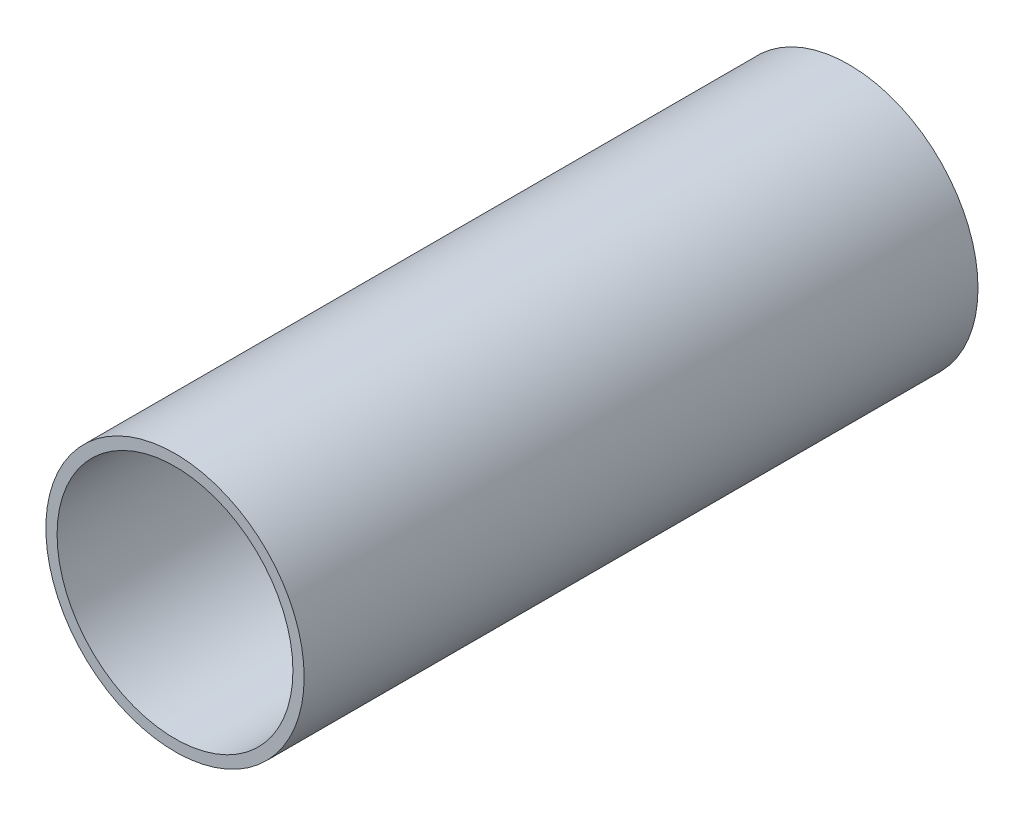
ISO-10303-21;
HEADER;
FILE_DESCRIPTION(('STEP AP214'),'2;1');
FILE_NAME('part.step','',(''),(''),'','','');
FILE_SCHEMA(('AUTOMOTIVE_DESIGN { 1 0 10303 214 1 1 1 1 }'));
ENDSEC;
DATA;
#1=APPLICATION_CONTEXT('core data for automotive mechanical design processes');
#2=APPLICATION_PROTOCOL_DEFINITION('international standard','automotive_design',2000,#1);
#3=PRODUCT_CONTEXT('',#1,'mechanical');
#4=PRODUCT('Part','Part','',(#3));
#5=PRODUCT_RELATED_PRODUCT_CATEGORY('part','',(#4));
#6=PRODUCT_DEFINITION_FORMATION('','',#4);
#7=PRODUCT_DEFINITION_CONTEXT('part definition',#1,'design');
#8=PRODUCT_DEFINITION('design','',#6,#7);
#9=PRODUCT_DEFINITION_SHAPE('','',#8);
#10=(LENGTH_UNIT() NAMED_UNIT(*) SI_UNIT(.MILLI.,.METRE.));
#11=(NAMED_UNIT(*) PLANE_ANGLE_UNIT() SI_UNIT($,.RADIAN.));
#12=(NAMED_UNIT(*) SI_UNIT($,.STERADIAN.) SOLID_ANGLE_UNIT());
#13=UNCERTAINTY_MEASURE_WITH_UNIT(LENGTH_MEASURE(1.E-05),#10,'distance_accuracy_value','');
#14=(GEOMETRIC_REPRESENTATION_CONTEXT(3) GLOBAL_UNCERTAINTY_ASSIGNED_CONTEXT((#13)) GLOBAL_UNIT_ASSIGNED_CONTEXT((#10,
#11,#12)) REPRESENTATION_CONTEXT('',''));
#15=CARTESIAN_POINT('',(0.,0.,0.));
#16=DIRECTION('',(0.,0.,1.));
#17=DIRECTION('',(1.,0.,0.));
#18=AXIS2_PLACEMENT_3D('',#15,#16,#17);
#19=CARTESIAN_POINT('',(0.,0.,300.));
#20=DIRECTION('',(0.,0.,1.));
#21=DIRECTION('',(1.,0.,0.));
#22=AXIS2_PLACEMENT_3D('',#19,#20,#21);
#23=PLANE('',#22);
#24=CARTESIAN_POINT('',(0.,0.,300.));
#25=DIRECTION('',(0.,0.,1.));
#26=DIRECTION('',(1.,0.,0.));
#27=AXIS2_PLACEMENT_3D('',#24,#25,#26);
#28=CIRCLE('',#27,57.5);
#29=CARTESIAN_POINT('',(57.5,0.,300.));
#30=VERTEX_POINT('',#29);
#31=EDGE_CURVE('E10',#30,#30,#28,.T.);
#32=ORIENTED_EDGE('',*,*,#31,.T.);
#33=EDGE_LOOP('',(#32));
#34=FACE_BOUND('',#33,.T.);
#35=CARTESIAN_POINT('',(0.,0.,300.));
#36=DIRECTION('',(0.,0.,1.));
#37=DIRECTION('',(1.,0.,0.));
#38=AXIS2_PLACEMENT_3D('',#35,#36,#37);
#39=CIRCLE('',#38,52.5);
#40=CARTESIAN_POINT('',(52.5,0.,300.));
#41=VERTEX_POINT('',#40);
#42=EDGE_CURVE('E44',#41,#41,#39,.T.);
#43=ORIENTED_EDGE('',*,*,#42,.F.);
#44=EDGE_LOOP('',(#43));
#45=FACE_BOUND('',#44,.T.);
#46=ADVANCED_FACE('F33',(#34,#45),#23,.T.);
#47=CARTESIAN_POINT('',(0.,0.,0.));
#48=DIRECTION('',(0.,0.,1.));
#49=DIRECTION('',(1.,0.,0.));
#50=AXIS2_PLACEMENT_3D('',#47,#48,#49);
#51=PLANE('',#50);
#52=CARTESIAN_POINT('',(0.,0.,0.));
#53=DIRECTION('',(0.,0.,1.));
#54=DIRECTION('',(1.,0.,0.));
#55=AXIS2_PLACEMENT_3D('',#52,#53,#54);
#56=CIRCLE('',#55,57.5);
#57=CARTESIAN_POINT('',(57.5,0.,0.));
#58=VERTEX_POINT('',#57);
#59=EDGE_CURVE('E37',#58,#58,#56,.T.);
#60=ORIENTED_EDGE('',*,*,#59,.F.);
#61=EDGE_LOOP('',(#60));
#62=FACE_BOUND('',#61,.T.);
#63=CARTESIAN_POINT('',(0.,0.,0.));
#64=DIRECTION('',(0.,0.,1.));
#65=DIRECTION('',(1.,0.,0.));
#66=AXIS2_PLACEMENT_3D('',#63,#64,#65);
#67=CIRCLE('',#66,52.5);
#68=CARTESIAN_POINT('',(52.5,0.,0.));
#69=VERTEX_POINT('',#68);
#70=EDGE_CURVE('E46',#69,#69,#67,.T.);
#71=ORIENTED_EDGE('',*,*,#70,.T.);
#72=EDGE_LOOP('',(#71));
#73=FACE_BOUND('',#72,.T.);
#74=ADVANCED_FACE('F56',(#62,#73),#51,.F.);
#75=CARTESIAN_POINT('',(0.,0.,300.));
#76=DIRECTION('',(0.,0.,-1.));
#77=DIRECTION('',(-1.,0.,0.));
#78=AXIS2_PLACEMENT_3D('',#75,#76,#77);
#79=CYLINDRICAL_SURFACE('',#78,57.5);
#80=ORIENTED_EDGE('',*,*,#31,.F.);
#81=EDGE_LOOP('',(#80));
#82=FACE_BOUND('',#81,.T.);
#83=ORIENTED_EDGE('',*,*,#59,.T.);
#84=EDGE_LOOP('',(#83));
#85=FACE_BOUND('',#84,.T.);
#86=ADVANCED_FACE('F35',(#82,#85),#79,.T.);
#87=CARTESIAN_POINT('',(0.,0.,300.));
#88=DIRECTION('',(0.,0.,-1.));
#89=DIRECTION('',(-1.,0.,0.));
#90=AXIS2_PLACEMENT_3D('',#87,#88,#89);
#91=CYLINDRICAL_SURFACE('',#90,52.5);
#92=ORIENTED_EDGE('',*,*,#42,.T.);
#93=EDGE_LOOP('',(#92));
#94=FACE_BOUND('',#93,.T.);
#95=ORIENTED_EDGE('',*,*,#70,.F.);
#96=EDGE_LOOP('',(#95));
#97=FACE_BOUND('',#96,.T.);
#98=ADVANCED_FACE('F52',(#94,#97),#91,.F.);
#99=CLOSED_SHELL('',(#46,#74,#86,#98));
#100=MANIFOLD_SOLID_BREP('B2',#99);
#101=ADVANCED_BREP_SHAPE_REPRESENTATION('',(#18,#100),#14);
#102=SHAPE_DEFINITION_REPRESENTATION(#9,#101);
ENDSEC;
END-ISO-10303-21;
